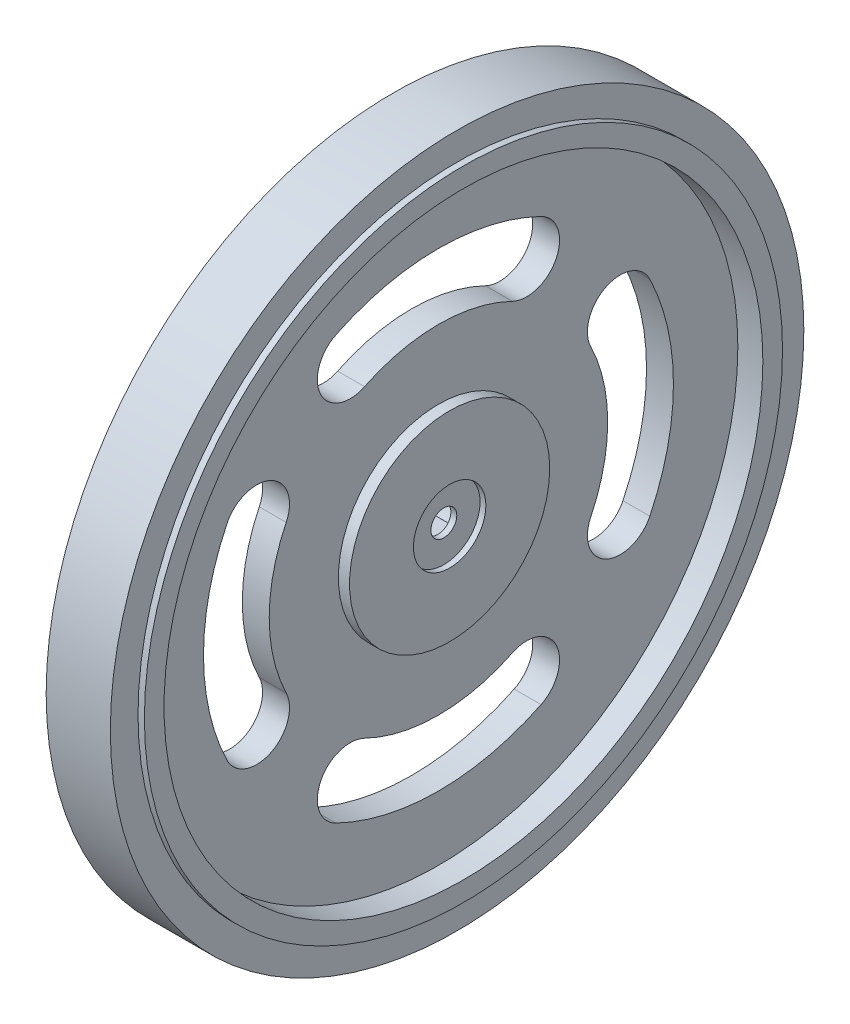
ISO-10303-21;
HEADER;
FILE_DESCRIPTION(('STEP AP214'),'2;1');
FILE_NAME('part.step','',(''),(''),'','','');
FILE_SCHEMA(('AUTOMOTIVE_DESIGN { 1 0 10303 214 1 1 1 1 }'));
ENDSEC;
DATA;
#1=APPLICATION_CONTEXT('core data for automotive mechanical design processes');
#2=APPLICATION_PROTOCOL_DEFINITION('international standard','automotive_design',2000,#1);
#3=PRODUCT_CONTEXT('',#1,'mechanical');
#4=PRODUCT('Part','Part','',(#3));
#5=PRODUCT_RELATED_PRODUCT_CATEGORY('part','',(#4));
#6=PRODUCT_DEFINITION_FORMATION('','',#4);
#7=PRODUCT_DEFINITION_CONTEXT('part definition',#1,'design');
#8=PRODUCT_DEFINITION('design','',#6,#7);
#9=PRODUCT_DEFINITION_SHAPE('','',#8);
#10=(LENGTH_UNIT() NAMED_UNIT(*) SI_UNIT(.MILLI.,.METRE.));
#11=(NAMED_UNIT(*) PLANE_ANGLE_UNIT() SI_UNIT($,.RADIAN.));
#12=(NAMED_UNIT(*) SI_UNIT($,.STERADIAN.) SOLID_ANGLE_UNIT());
#13=UNCERTAINTY_MEASURE_WITH_UNIT(LENGTH_MEASURE(1.E-05),#10,'distance_accuracy_value','');
#14=(GEOMETRIC_REPRESENTATION_CONTEXT(3) GLOBAL_UNCERTAINTY_ASSIGNED_CONTEXT((#13)) GLOBAL_UNIT_ASSIGNED_CONTEXT((#10,
#11,#12)) REPRESENTATION_CONTEXT('',''));
#15=CARTESIAN_POINT('',(0.,0.,0.));
#16=DIRECTION('',(0.,0.,1.));
#17=DIRECTION('',(1.,0.,0.));
#18=AXIS2_PLACEMENT_3D('',#15,#16,#17);
#19=CARTESIAN_POINT('',(15.9165289224664,0.,0.));
#20=DIRECTION('',(1.,0.,0.));
#21=DIRECTION('',(0.,0.,-1.));
#22=AXIS2_PLACEMENT_3D('',#19,#20,#21);
#23=CYLINDRICAL_SURFACE('',#22,3.49999999999999);
#24=CARTESIAN_POINT('',(-3.9,0.,0.));
#25=DIRECTION('',(1.,0.,0.));
#26=DIRECTION('',(0.,0.,-1.));
#27=AXIS2_PLACEMENT_3D('',#24,#25,#26);
#28=CIRCLE('',#27,3.49999999999999);
#29=CARTESIAN_POINT('',(-3.9,-2.375,-2.57087047515038));
#30=VERTEX_POINT('',#29);
#31=CARTESIAN_POINT('',(-3.9,2.375,-2.57087047515038));
#32=VERTEX_POINT('',#31);
#33=EDGE_CURVE('E196',#30,#32,#28,.T.);
#34=ORIENTED_EDGE('',*,*,#33,.F.);
#35=DIRECTION('',(1.,0.,0.));
#36=VECTOR('',#35,1.);
#37=CARTESIAN_POINT('',(-9.16337581785681,-2.375,-2.57087047515038));
#38=LINE('',#37,#36);
#39=CARTESIAN_POINT('',(1.25,-2.375,-2.57087047515038));
#40=VERTEX_POINT('',#39);
#41=EDGE_CURVE('E176',#30,#40,#38,.T.);
#42=ORIENTED_EDGE('',*,*,#41,.T.);
#43=CARTESIAN_POINT('',(1.25,0.,0.));
#44=DIRECTION('',(1.,0.,0.));
#45=DIRECTION('',(0.,0.,-1.));
#46=AXIS2_PLACEMENT_3D('',#43,#44,#45);
#47=CIRCLE('',#46,3.49999999999999);
#48=CARTESIAN_POINT('',(1.25,2.375,-2.57087047515038));
#49=VERTEX_POINT('',#48);
#50=EDGE_CURVE('E58',#40,#49,#47,.T.);
#51=ORIENTED_EDGE('',*,*,#50,.T.);
#52=DIRECTION('',(1.,0.,0.));
#53=VECTOR('',#52,1.);
#54=CARTESIAN_POINT('',(-9.16337581785681,2.375,-2.57087047515038));
#55=LINE('',#54,#53);
#56=EDGE_CURVE('E659',#32,#49,#55,.T.);
#57=ORIENTED_EDGE('',*,*,#56,.F.);
#58=EDGE_LOOP('',(#34,#42,#51,#57));
#59=FACE_BOUND('',#58,.T.);
#60=ADVANCED_FACE('F35',(#59),#23,.F.);
#61=CARTESIAN_POINT('',(1.25,2.375,2.57087047515038));
#62=VERTEX_POINT('',#61);
#63=CARTESIAN_POINT('',(1.25,-2.375,2.57087047515038));
#64=VERTEX_POINT('',#63);
#65=EDGE_CURVE('E188',#62,#64,#47,.T.);
#66=ORIENTED_EDGE('',*,*,#65,.T.);
#67=DIRECTION('',(1.,0.,0.));
#68=VECTOR('',#67,1.);
#69=CARTESIAN_POINT('',(-9.16337581785681,-2.375,2.57087047515038));
#70=LINE('',#69,#68);
#71=CARTESIAN_POINT('',(-3.9,-2.375,2.57087047515038));
#72=VERTEX_POINT('',#71);
#73=EDGE_CURVE('E174',#72,#64,#70,.T.);
#74=ORIENTED_EDGE('',*,*,#73,.F.);
#75=CARTESIAN_POINT('',(-3.9,2.375,2.57087047515039));
#76=VERTEX_POINT('',#75);
#77=EDGE_CURVE('E186',#76,#72,#28,.T.);
#78=ORIENTED_EDGE('',*,*,#77,.F.);
#79=DIRECTION('',(1.,0.,0.));
#80=VECTOR('',#79,1.);
#81=CARTESIAN_POINT('',(-9.16337581785681,2.375,2.57087047515038));
#82=LINE('',#81,#80);
#83=EDGE_CURVE('E178',#76,#62,#82,.T.);
#84=ORIENTED_EDGE('',*,*,#83,.T.);
#85=EDGE_LOOP('',(#66,#74,#78,#84));
#86=FACE_BOUND('',#85,.T.);
#87=ADVANCED_FACE('F184',(#86),#23,.F.);
#88=CARTESIAN_POINT('',(1.25,3.49999999999999,0.));
#89=DIRECTION('',(-1.,0.,0.));
#90=DIRECTION('',(0.,0.,1.));
#91=AXIS2_PLACEMENT_3D('',#88,#89,#90);
#92=PLANE('',#91);
#93=CARTESIAN_POINT('',(1.25,0.,0.));
#94=DIRECTION('',(1.,0.,0.));
#95=DIRECTION('',(0.,0.,-1.));
#96=AXIS2_PLACEMENT_3D('',#93,#94,#95);
#97=CIRCLE('',#96,1.25);
#98=CARTESIAN_POINT('',(1.25,0.,-1.25));
#99=VERTEX_POINT('',#98);
#100=EDGE_CURVE('E652',#99,#99,#97,.T.);
#101=ORIENTED_EDGE('',*,*,#100,.T.);
#102=EDGE_LOOP('',(#101));
#103=FACE_BOUND('',#102,.T.);
#104=ORIENTED_EDGE('',*,*,#50,.F.);
#105=DIRECTION('',(0.,0.,-1.));
#106=VECTOR('',#105,1.);
#107=CARTESIAN_POINT('',(1.25,-2.375,-2.57087047515038));
#108=LINE('',#107,#106);
#109=EDGE_CURVE('E179',#64,#40,#108,.T.);
#110=ORIENTED_EDGE('',*,*,#109,.F.);
#111=ORIENTED_EDGE('',*,*,#65,.F.);
#112=DIRECTION('',(0.,0.,1.));
#113=VECTOR('',#112,1.);
#114=CARTESIAN_POINT('',(1.25,2.375,-2.57087047515038));
#115=LINE('',#114,#113);
#116=EDGE_CURVE('E658',#49,#62,#115,.T.);
#117=ORIENTED_EDGE('',*,*,#116,.F.);
#118=EDGE_LOOP('',(#104,#110,#111,#117));
#119=FACE_BOUND('',#118,.T.);
#120=ADVANCED_FACE('F246',(#103,#119),#92,.T.);
#121=CARTESIAN_POINT('',(3.715,28.925,0.));
#122=DIRECTION('',(1.,0.,0.));
#123=DIRECTION('',(0.,0.,-1.));
#124=AXIS2_PLACEMENT_3D('',#121,#122,#123);
#125=PLANE('',#124);
#126=CARTESIAN_POINT('',(3.715,0.,0.));
#127=DIRECTION('',(1.,0.,0.));
#128=DIRECTION('',(0.,0.,-1.));
#129=AXIS2_PLACEMENT_3D('',#126,#127,#128);
#130=CIRCLE('',#129,30.825);
#131=CARTESIAN_POINT('',(3.715,0.,-30.825));
#132=VERTEX_POINT('',#131);
#133=EDGE_CURVE('E11',#132,#132,#130,.T.);
#134=ORIENTED_EDGE('',*,*,#133,.T.);
#135=EDGE_LOOP('',(#134));
#136=FACE_BOUND('',#135,.T.);
#137=CARTESIAN_POINT('',(3.715,0.,0.));
#138=DIRECTION('',(1.,0.,0.));
#139=DIRECTION('',(0.,0.,-1.));
#140=AXIS2_PLACEMENT_3D('',#137,#138,#139);
#141=CIRCLE('',#140,28.925);
#142=CARTESIAN_POINT('',(3.715,0.,-28.925));
#143=VERTEX_POINT('',#142);
#144=EDGE_CURVE('E627',#143,#143,#141,.T.);
#145=ORIENTED_EDGE('',*,*,#144,.F.);
#146=EDGE_LOOP('',(#145));
#147=FACE_BOUND('',#146,.T.);
#148=ADVANCED_FACE('F37',(#136,#147),#125,.T.);
#149=CARTESIAN_POINT('',(15.9165289224664,0.,0.));
#150=DIRECTION('',(1.,0.,0.));
#151=DIRECTION('',(0.,0.,-1.));
#152=AXIS2_PLACEMENT_3D('',#149,#150,#151);
#153=CYLINDRICAL_SURFACE('',#152,30.825);
#154=CARTESIAN_POINT('',(3.1,0.,0.));
#155=DIRECTION('',(1.,0.,0.));
#156=DIRECTION('',(0.,0.,-1.));
#157=AXIS2_PLACEMENT_3D('',#154,#155,#156);
#158=CIRCLE('',#157,30.825);
#159=CARTESIAN_POINT('',(3.1,0.,-30.825));
#160=VERTEX_POINT('',#159);
#161=EDGE_CURVE('E43',#160,#160,#158,.T.);
#162=ORIENTED_EDGE('',*,*,#161,.T.);
#163=EDGE_LOOP('',(#162));
#164=FACE_BOUND('',#163,.T.);
#165=ORIENTED_EDGE('',*,*,#133,.F.);
#166=EDGE_LOOP('',(#165));
#167=FACE_BOUND('',#166,.T.);
#168=ADVANCED_FACE('F226',(#164,#167),#153,.T.);
#169=CARTESIAN_POINT('',(3.1,30.825,0.));
#170=DIRECTION('',(1.,0.,0.));
#171=DIRECTION('',(0.,0.,-1.));
#172=AXIS2_PLACEMENT_3D('',#169,#170,#171);
#173=PLANE('',#172);
#174=CARTESIAN_POINT('',(3.1,0.,0.));
#175=DIRECTION('',(1.,0.,0.));
#176=DIRECTION('',(0.,0.,-1.));
#177=AXIS2_PLACEMENT_3D('',#174,#175,#176);
#178=CIRCLE('',#177,33.5);
#179=CARTESIAN_POINT('',(3.1,0.,-33.5));
#180=VERTEX_POINT('',#179);
#181=EDGE_CURVE('E221',#180,#180,#178,.T.);
#182=ORIENTED_EDGE('',*,*,#181,.T.);
#183=EDGE_LOOP('',(#182));
#184=FACE_BOUND('',#183,.T.);
#185=ORIENTED_EDGE('',*,*,#161,.F.);
#186=EDGE_LOOP('',(#185));
#187=FACE_BOUND('',#186,.T.);
#188=ADVANCED_FACE('F229',(#184,#187),#173,.T.);
#189=CARTESIAN_POINT('',(15.9165289224664,0.,0.));
#190=DIRECTION('',(1.,0.,0.));
#191=DIRECTION('',(0.,0.,-1.));
#192=AXIS2_PLACEMENT_3D('',#189,#190,#191);
#193=CYLINDRICAL_SURFACE('',#192,33.5);
#194=CARTESIAN_POINT('',(-3.1,0.,0.));
#195=DIRECTION('',(1.,0.,0.));
#196=DIRECTION('',(0.,0.,-1.));
#197=AXIS2_PLACEMENT_3D('',#194,#195,#196);
#198=CIRCLE('',#197,33.5);
#199=CARTESIAN_POINT('',(-3.1,0.,-33.5));
#200=VERTEX_POINT('',#199);
#201=EDGE_CURVE('E218',#200,#200,#198,.T.);
#202=ORIENTED_EDGE('',*,*,#201,.T.);
#203=EDGE_LOOP('',(#202));
#204=FACE_BOUND('',#203,.T.);
#205=ORIENTED_EDGE('',*,*,#181,.F.);
#206=EDGE_LOOP('',(#205));
#207=FACE_BOUND('',#206,.T.);
#208=ADVANCED_FACE('F231',(#204,#207),#193,.T.);
#209=CARTESIAN_POINT('',(-3.1,33.5,0.));
#210=DIRECTION('',(-1.,0.,0.));
#211=DIRECTION('',(0.,0.,1.));
#212=AXIS2_PLACEMENT_3D('',#209,#210,#211);
#213=PLANE('',#212);
#214=CARTESIAN_POINT('',(-3.1,0.,0.));
#215=DIRECTION('',(1.,0.,0.));
#216=DIRECTION('',(0.,0.,-1.));
#217=AXIS2_PLACEMENT_3D('',#214,#215,#216);
#218=CIRCLE('',#217,30.825);
#219=CARTESIAN_POINT('',(-3.1,0.,-30.825));
#220=VERTEX_POINT('',#219);
#221=EDGE_CURVE('E215',#220,#220,#218,.T.);
#222=ORIENTED_EDGE('',*,*,#221,.T.);
#223=EDGE_LOOP('',(#222));
#224=FACE_BOUND('',#223,.T.);
#225=ORIENTED_EDGE('',*,*,#201,.F.);
#226=EDGE_LOOP('',(#225));
#227=FACE_BOUND('',#226,.T.);
#228=ADVANCED_FACE('F238',(#224,#227),#213,.T.);
#229=CARTESIAN_POINT('',(15.9165289224664,0.,0.));
#230=DIRECTION('',(1.,0.,0.));
#231=DIRECTION('',(0.,0.,-1.));
#232=AXIS2_PLACEMENT_3D('',#229,#230,#231);
#233=CYLINDRICAL_SURFACE('',#232,30.825);
#234=CARTESIAN_POINT('',(-3.715,0.,0.));
#235=DIRECTION('',(1.,0.,0.));
#236=DIRECTION('',(0.,0.,-1.));
#237=AXIS2_PLACEMENT_3D('',#234,#235,#236);
#238=CIRCLE('',#237,30.825);
#239=CARTESIAN_POINT('',(-3.715,0.,-30.825));
#240=VERTEX_POINT('',#239);
#241=EDGE_CURVE('E212',#240,#240,#238,.T.);
#242=ORIENTED_EDGE('',*,*,#241,.T.);
#243=EDGE_LOOP('',(#242));
#244=FACE_BOUND('',#243,.T.);
#245=ORIENTED_EDGE('',*,*,#221,.F.);
#246=EDGE_LOOP('',(#245));
#247=FACE_BOUND('',#246,.T.);
#248=ADVANCED_FACE('F268',(#244,#247),#233,.T.);
#249=CARTESIAN_POINT('',(-3.715,30.825,0.));
#250=DIRECTION('',(-1.,0.,0.));
#251=DIRECTION('',(0.,0.,1.));
#252=AXIS2_PLACEMENT_3D('',#249,#250,#251);
#253=PLANE('',#252);
#254=CARTESIAN_POINT('',(-3.715,0.,0.));
#255=DIRECTION('',(1.,0.,0.));
#256=DIRECTION('',(0.,0.,-1.));
#257=AXIS2_PLACEMENT_3D('',#254,#255,#256);
#258=CIRCLE('',#257,28.925);
#259=CARTESIAN_POINT('',(-3.715,0.,-28.925));
#260=VERTEX_POINT('',#259);
#261=EDGE_CURVE('E209',#260,#260,#258,.T.);
#262=ORIENTED_EDGE('',*,*,#261,.T.);
#263=EDGE_LOOP('',(#262));
#264=FACE_BOUND('',#263,.T.);
#265=ORIENTED_EDGE('',*,*,#241,.F.);
#266=EDGE_LOOP('',(#265));
#267=FACE_BOUND('',#266,.T.);
#268=ADVANCED_FACE('F264',(#264,#267),#253,.T.);
#269=CARTESIAN_POINT('',(15.9165289224664,0.,0.));
#270=DIRECTION('',(1.,0.,0.));
#271=DIRECTION('',(0.,0.,-1.));
#272=AXIS2_PLACEMENT_3D('',#269,#270,#271);
#273=CYLINDRICAL_SURFACE('',#272,28.925);
#274=CARTESIAN_POINT('',(-1.3,0.,0.));
#275=DIRECTION('',(1.,0.,0.));
#276=DIRECTION('',(0.,0.,-1.));
#277=AXIS2_PLACEMENT_3D('',#274,#275,#276);
#278=CIRCLE('',#277,28.925);
#279=CARTESIAN_POINT('',(-1.3,0.,-28.925));
#280=VERTEX_POINT('',#279);
#281=EDGE_CURVE('E206',#280,#280,#278,.T.);
#282=ORIENTED_EDGE('',*,*,#281,.T.);
#283=EDGE_LOOP('',(#282));
#284=FACE_BOUND('',#283,.T.);
#285=ORIENTED_EDGE('',*,*,#261,.F.);
#286=EDGE_LOOP('',(#285));
#287=FACE_BOUND('',#286,.T.);
#288=ADVANCED_FACE('F260',(#284,#287),#273,.F.);
#289=CARTESIAN_POINT('',(-1.3,4.975,0.));
#290=DIRECTION('',(-1.,0.,0.));
#291=DIRECTION('',(0.,0.,1.));
#292=AXIS2_PLACEMENT_3D('',#289,#290,#291);
#293=PLANE('',#292);
#294=CARTESIAN_POINT('',(-1.3,8.52500000000018,17.5655913649383));
#295=DIRECTION('',(-1.,0.,0.));
#296=DIRECTION('',(0.,0.,1.));
#297=AXIS2_PLACEMENT_3D('',#294,#295,#296);
#298=CIRCLE('',#297,3.17500000000001);
#299=CARTESIAN_POINT('',(-1.3,7.13873239436634,14.7092147921507));
#300=VERTEX_POINT('',#299);
#301=CARTESIAN_POINT('',(-1.3,9.91126760563401,20.421967937726));
#302=VERTEX_POINT('',#301);
#303=EDGE_CURVE('E672',#300,#302,#298,.F.);
#304=ORIENTED_EDGE('',*,*,#303,.T.);
#305=CARTESIAN_POINT('',(-1.3,0.,0.));
#306=DIRECTION('',(-1.,0.,0.));
#307=DIRECTION('',(0.,0.,1.));
#308=AXIS2_PLACEMENT_3D('',#305,#306,#307);
#309=CIRCLE('',#308,22.7);
#310=CARTESIAN_POINT('',(-1.3,-9.91126760563358,20.4219679377262));
#311=VERTEX_POINT('',#310);
#312=EDGE_CURVE('E689',#302,#311,#309,.F.);
#313=ORIENTED_EDGE('',*,*,#312,.T.);
#314=CARTESIAN_POINT('',(-1.3,-8.52499999999981,17.5655913649385));
#315=DIRECTION('',(-1.,0.,0.));
#316=DIRECTION('',(0.,0.,1.));
#317=AXIS2_PLACEMENT_3D('',#314,#315,#316);
#318=CIRCLE('',#317,3.17500000000001);
#319=CARTESIAN_POINT('',(-1.3,-7.13873239436603,14.7092147921508));
#320=VERTEX_POINT('',#319);
#321=EDGE_CURVE('E661',#311,#320,#318,.F.);
#322=ORIENTED_EDGE('',*,*,#321,.T.);
#323=CARTESIAN_POINT('',(-1.3,0.,0.));
#324=DIRECTION('',(-1.,0.,0.));
#325=DIRECTION('',(0.,0.,1.));
#326=AXIS2_PLACEMENT_3D('',#323,#324,#325);
#327=CIRCLE('',#326,16.35);
#328=EDGE_CURVE('E669',#320,#300,#327,.T.);
#329=ORIENTED_EDGE('',*,*,#328,.T.);
#330=EDGE_LOOP('',(#304,#313,#322,#329));
#331=FACE_BOUND('',#330,.T.);
#332=CARTESIAN_POINT('',(-1.3,-17.5655913649384,8.52499999999998));
#333=DIRECTION('',(-1.,0.,0.));
#334=DIRECTION('',(0.,0.,1.));
#335=AXIS2_PLACEMENT_3D('',#332,#333,#334);
#336=CIRCLE('',#335,3.175);
#337=CARTESIAN_POINT('',(-1.3,-14.7092147921508,7.13873239436619));
#338=VERTEX_POINT('',#337);
#339=CARTESIAN_POINT('',(-1.3,-20.4219679377261,9.91126760563379));
#340=VERTEX_POINT('',#339);
#341=EDGE_CURVE('E704',#338,#340,#336,.F.);
#342=ORIENTED_EDGE('',*,*,#341,.T.);
#343=CARTESIAN_POINT('',(-1.3,0.,0.));
#344=DIRECTION('',(-1.,0.,0.));
#345=DIRECTION('',(0.,0.,1.));
#346=AXIS2_PLACEMENT_3D('',#343,#344,#345);
#347=CIRCLE('',#346,22.7);
#348=CARTESIAN_POINT('',(-1.3,-20.4219679377261,-9.91126760563382));
#349=VERTEX_POINT('',#348);
#350=EDGE_CURVE('E721',#340,#349,#347,.F.);
#351=ORIENTED_EDGE('',*,*,#350,.T.);
#352=CARTESIAN_POINT('',(-1.3,-17.5655913649384,-8.52500000000001));
#353=DIRECTION('',(-1.,0.,0.));
#354=DIRECTION('',(0.,0.,1.));
#355=AXIS2_PLACEMENT_3D('',#352,#353,#354);
#356=CIRCLE('',#355,3.17500000000001);
#357=CARTESIAN_POINT('',(-1.3,-14.7092147921507,-7.1387323943662));
#358=VERTEX_POINT('',#357);
#359=EDGE_CURVE('E698',#349,#358,#356,.F.);
#360=ORIENTED_EDGE('',*,*,#359,.T.);
#361=CARTESIAN_POINT('',(-1.3,0.,0.));
#362=DIRECTION('',(-1.,0.,0.));
#363=DIRECTION('',(0.,0.,1.));
#364=AXIS2_PLACEMENT_3D('',#361,#362,#363);
#365=CIRCLE('',#364,16.35);
#366=EDGE_CURVE('E701',#358,#338,#365,.T.);
#367=ORIENTED_EDGE('',*,*,#366,.T.);
#368=EDGE_LOOP('',(#342,#351,#360,#367));
#369=FACE_BOUND('',#368,.T.);
#370=CARTESIAN_POINT('',(-1.3,-8.52499999999992,-17.5655913649385));
#371=DIRECTION('',(-1.,0.,0.));
#372=DIRECTION('',(0.,0.,1.));
#373=AXIS2_PLACEMENT_3D('',#370,#371,#372);
#374=CIRCLE('',#373,3.17500000000001);
#375=CARTESIAN_POINT('',(-1.3,-7.13873239436612,-14.7092147921508));
#376=VERTEX_POINT('',#375);
#377=CARTESIAN_POINT('',(-1.3,-9.91126760563371,-20.4219679377262));
#378=VERTEX_POINT('',#377);
#379=EDGE_CURVE('E736',#376,#378,#374,.F.);
#380=ORIENTED_EDGE('',*,*,#379,.T.);
#381=CARTESIAN_POINT('',(-1.3,0.,0.));
#382=DIRECTION('',(-1.,0.,0.));
#383=DIRECTION('',(0.,0.,1.));
#384=AXIS2_PLACEMENT_3D('',#381,#382,#383);
#385=CIRCLE('',#384,22.7);
#386=CARTESIAN_POINT('',(-1.3,9.91126760563388,-20.4219679377261));
#387=VERTEX_POINT('',#386);
#388=EDGE_CURVE('E753',#378,#387,#385,.F.);
#389=ORIENTED_EDGE('',*,*,#388,.T.);
#390=CARTESIAN_POINT('',(-1.3,8.52500000000007,-17.5655913649384));
#391=DIRECTION('',(-1.,0.,0.));
#392=DIRECTION('',(0.,0.,1.));
#393=AXIS2_PLACEMENT_3D('',#390,#391,#392);
#394=CIRCLE('',#393,3.17500000000001);
#395=CARTESIAN_POINT('',(-1.3,7.13873239436625,-14.7092147921507));
#396=VERTEX_POINT('',#395);
#397=EDGE_CURVE('E730',#387,#396,#394,.F.);
#398=ORIENTED_EDGE('',*,*,#397,.T.);
#399=CARTESIAN_POINT('',(-1.3,0.,0.));
#400=DIRECTION('',(-1.,0.,0.));
#401=DIRECTION('',(0.,0.,1.));
#402=AXIS2_PLACEMENT_3D('',#399,#400,#401);
#403=CIRCLE('',#402,16.35);
#404=EDGE_CURVE('E733',#396,#376,#403,.T.);
#405=ORIENTED_EDGE('',*,*,#404,.T.);
#406=EDGE_LOOP('',(#380,#389,#398,#405));
#407=FACE_BOUND('',#406,.T.);
#408=CARTESIAN_POINT('',(-1.3,17.5655913649385,-8.52499999999986));
#409=DIRECTION('',(-1.,0.,0.));
#410=DIRECTION('',(0.,0.,1.));
#411=AXIS2_PLACEMENT_3D('',#408,#409,#410);
#412=CIRCLE('',#411,3.17500000000001);
#413=CARTESIAN_POINT('',(-1.3,14.7092147921508,-7.13873239436607));
#414=VERTEX_POINT('',#413);
#415=CARTESIAN_POINT('',(-1.3,20.4219679377262,-9.91126760563364));
#416=VERTEX_POINT('',#415);
#417=EDGE_CURVE('E768',#414,#416,#412,.F.);
#418=ORIENTED_EDGE('',*,*,#417,.T.);
#419=CARTESIAN_POINT('',(-1.3,0.,0.));
#420=DIRECTION('',(-1.,0.,0.));
#421=DIRECTION('',(0.,0.,1.));
#422=AXIS2_PLACEMENT_3D('',#419,#420,#421);
#423=CIRCLE('',#422,22.7);
#424=CARTESIAN_POINT('',(-1.3,20.4219679377261,9.91126760563396));
#425=VERTEX_POINT('',#424);
#426=EDGE_CURVE('E629',#416,#425,#423,.F.);
#427=ORIENTED_EDGE('',*,*,#426,.T.);
#428=CARTESIAN_POINT('',(-1.3,17.5655913649384,8.52500000000013));
#429=DIRECTION('',(-1.,0.,0.));
#430=DIRECTION('',(0.,0.,1.));
#431=AXIS2_PLACEMENT_3D('',#428,#429,#430);
#432=CIRCLE('',#431,3.17500000000001);
#433=CARTESIAN_POINT('',(-1.3,14.7092147921507,7.1387323943663));
#434=VERTEX_POINT('',#433);
#435=EDGE_CURVE('E762',#425,#434,#432,.F.);
#436=ORIENTED_EDGE('',*,*,#435,.T.);
#437=CARTESIAN_POINT('',(-1.3,0.,0.));
#438=DIRECTION('',(-1.,0.,0.));
#439=DIRECTION('',(0.,0.,1.));
#440=AXIS2_PLACEMENT_3D('',#437,#438,#439);
#441=CIRCLE('',#440,16.35);
#442=EDGE_CURVE('E765',#434,#414,#441,.T.);
#443=ORIENTED_EDGE('',*,*,#442,.T.);
#444=EDGE_LOOP('',(#418,#427,#436,#443));
#445=FACE_BOUND('',#444,.T.);
#446=CARTESIAN_POINT('',(-1.3,0.,0.));
#447=DIRECTION('',(1.,0.,0.));
#448=DIRECTION('',(0.,0.,-1.));
#449=AXIS2_PLACEMENT_3D('',#446,#447,#448);
#450=CIRCLE('',#449,4.975);
#451=CARTESIAN_POINT('',(-1.3,0.,-4.975));
#452=VERTEX_POINT('',#451);
#453=EDGE_CURVE('E199',#452,#452,#450,.T.);
#454=ORIENTED_EDGE('',*,*,#453,.T.);
#455=EDGE_LOOP('',(#454));
#456=FACE_BOUND('',#455,.T.);
#457=ORIENTED_EDGE('',*,*,#281,.F.);
#458=EDGE_LOOP('',(#457));
#459=FACE_BOUND('',#458,.T.);
#460=ADVANCED_FACE('F256',(#331,#369,#407,#445,#456,#459),#293,.T.);
#461=CARTESIAN_POINT('',(-1.3,0.,0.));
#462=DIRECTION('',(1.,0.,0.));
#463=DIRECTION('',(0.,0.,-1.));
#464=AXIS2_PLACEMENT_3D('',#461,#462,#463);
#465=CONICAL_SURFACE('',#464,4.975,0.180699523279293);
#466=CARTESIAN_POINT('',(-3.9,0.,0.));
#467=DIRECTION('',(1.,0.,0.));
#468=DIRECTION('',(0.,0.,-1.));
#469=AXIS2_PLACEMENT_3D('',#466,#467,#468);
#470=CIRCLE('',#469,4.5);
#471=CARTESIAN_POINT('',(-3.9,0.,-4.5));
#472=VERTEX_POINT('',#471);
#473=EDGE_CURVE('E195',#472,#472,#470,.T.);
#474=ORIENTED_EDGE('',*,*,#473,.T.);
#475=EDGE_LOOP('',(#474));
#476=FACE_BOUND('',#475,.T.);
#477=ORIENTED_EDGE('',*,*,#453,.F.);
#478=EDGE_LOOP('',(#477));
#479=FACE_BOUND('',#478,.T.);
#480=ADVANCED_FACE('F253',(#476,#479),#465,.T.);
#481=CARTESIAN_POINT('',(-3.9,4.5,0.));
#482=DIRECTION('',(-1.,0.,0.));
#483=DIRECTION('',(0.,0.,1.));
#484=AXIS2_PLACEMENT_3D('',#481,#482,#483);
#485=PLANE('',#484);
#486=ORIENTED_EDGE('',*,*,#77,.T.);
#487=DIRECTION('',(0.,0.,-1.));
#488=VECTOR('',#487,1.);
#489=CARTESIAN_POINT('',(-3.9,-2.375,-2.57087047515038));
#490=LINE('',#489,#488);
#491=EDGE_CURVE('E50',#72,#30,#490,.T.);
#492=ORIENTED_EDGE('',*,*,#491,.T.);
#493=ORIENTED_EDGE('',*,*,#33,.T.);
#494=DIRECTION('',(0.,0.,1.));
#495=VECTOR('',#494,1.);
#496=CARTESIAN_POINT('',(-3.9,2.375,-2.57087047515038));
#497=LINE('',#496,#495);
#498=EDGE_CURVE('E194',#32,#76,#497,.T.);
#499=ORIENTED_EDGE('',*,*,#498,.T.);
#500=EDGE_LOOP('',(#486,#492,#493,#499));
#501=FACE_BOUND('',#500,.T.);
#502=ORIENTED_EDGE('',*,*,#473,.F.);
#503=EDGE_LOOP('',(#502));
#504=FACE_BOUND('',#503,.T.);
#505=ADVANCED_FACE('F191',(#501,#504),#485,.T.);
#506=CARTESIAN_POINT('',(15.9165289224664,0.,0.));
#507=DIRECTION('',(1.,0.,0.));
#508=DIRECTION('',(0.,0.,-1.));
#509=AXIS2_PLACEMENT_3D('',#506,#507,#508);
#510=CYLINDRICAL_SURFACE('',#509,1.25);
#511=CARTESIAN_POINT('',(1.82,0.,0.));
#512=DIRECTION('',(1.,0.,0.));
#513=DIRECTION('',(0.,0.,-1.));
#514=AXIS2_PLACEMENT_3D('',#511,#512,#513);
#515=CIRCLE('',#514,1.25);
#516=CARTESIAN_POINT('',(1.82,0.,-1.25));
#517=VERTEX_POINT('',#516);
#518=EDGE_CURVE('E650',#517,#517,#515,.T.);
#519=ORIENTED_EDGE('',*,*,#518,.T.);
#520=EDGE_LOOP('',(#519));
#521=FACE_BOUND('',#520,.T.);
#522=ORIENTED_EDGE('',*,*,#100,.F.);
#523=EDGE_LOOP('',(#522));
#524=FACE_BOUND('',#523,.T.);
#525=ADVANCED_FACE('F252',(#521,#524),#510,.F.);
#526=CARTESIAN_POINT('',(1.82,1.25,0.));
#527=DIRECTION('',(1.,0.,0.));
#528=DIRECTION('',(0.,0.,-1.));
#529=AXIS2_PLACEMENT_3D('',#526,#527,#528);
#530=PLANE('',#529);
#531=CARTESIAN_POINT('',(1.82,0.,0.));
#532=DIRECTION('',(1.,0.,0.));
#533=DIRECTION('',(0.,0.,-1.));
#534=AXIS2_PLACEMENT_3D('',#531,#532,#533);
#535=CIRCLE('',#534,3.49999999999999);
#536=CARTESIAN_POINT('',(1.82,0.,-3.49999999999999));
#537=VERTEX_POINT('',#536);
#538=EDGE_CURVE('E647',#537,#537,#535,.T.);
#539=ORIENTED_EDGE('',*,*,#538,.T.);
#540=EDGE_LOOP('',(#539));
#541=FACE_BOUND('',#540,.T.);
#542=ORIENTED_EDGE('',*,*,#518,.F.);
#543=EDGE_LOOP('',(#542));
#544=FACE_BOUND('',#543,.T.);
#545=ADVANCED_FACE('F319',(#541,#544),#530,.T.);
#546=CARTESIAN_POINT('',(15.9165289224664,0.,0.));
#547=DIRECTION('',(1.,0.,0.));
#548=DIRECTION('',(0.,0.,-1.));
#549=AXIS2_PLACEMENT_3D('',#546,#547,#548);
#550=CYLINDRICAL_SURFACE('',#549,3.49999999999999);
#551=CARTESIAN_POINT('',(2.38,0.,0.));
#552=DIRECTION('',(1.,0.,0.));
#553=DIRECTION('',(0.,0.,-1.));
#554=AXIS2_PLACEMENT_3D('',#551,#552,#553);
#555=CIRCLE('',#554,3.49999999999999);
#556=CARTESIAN_POINT('',(2.38,0.,-3.49999999999999));
#557=VERTEX_POINT('',#556);
#558=EDGE_CURVE('E644',#557,#557,#555,.T.);
#559=ORIENTED_EDGE('',*,*,#558,.T.);
#560=EDGE_LOOP('',(#559));
#561=FACE_BOUND('',#560,.T.);
#562=ORIENTED_EDGE('',*,*,#538,.F.);
#563=EDGE_LOOP('',(#562));
#564=FACE_BOUND('',#563,.T.);
#565=ADVANCED_FACE('F326',(#561,#564),#550,.F.);
#566=CARTESIAN_POINT('',(2.38,3.49999999999999,0.));
#567=DIRECTION('',(1.,0.,0.));
#568=DIRECTION('',(0.,0.,-1.));
#569=AXIS2_PLACEMENT_3D('',#566,#567,#568);
#570=PLANE('',#569);
#571=CARTESIAN_POINT('',(2.38,0.,0.));
#572=DIRECTION('',(1.,0.,0.));
#573=DIRECTION('',(0.,0.,-1.));
#574=AXIS2_PLACEMENT_3D('',#571,#572,#573);
#575=CIRCLE('',#574,9.67);
#576=CARTESIAN_POINT('',(2.38,0.,-9.67));
#577=VERTEX_POINT('',#576);
#578=EDGE_CURVE('E641',#577,#577,#575,.T.);
#579=ORIENTED_EDGE('',*,*,#578,.T.);
#580=EDGE_LOOP('',(#579));
#581=FACE_BOUND('',#580,.T.);
#582=ORIENTED_EDGE('',*,*,#558,.F.);
#583=EDGE_LOOP('',(#582));
#584=FACE_BOUND('',#583,.T.);
#585=ADVANCED_FACE('F334',(#581,#584),#570,.T.);
#586=CARTESIAN_POINT('',(15.9165289224664,0.,0.));
#587=DIRECTION('',(1.,0.,0.));
#588=DIRECTION('',(0.,0.,-1.));
#589=AXIS2_PLACEMENT_3D('',#586,#587,#588);
#590=CYLINDRICAL_SURFACE('',#589,9.67);
#591=CARTESIAN_POINT('',(1.3,0.,0.));
#592=DIRECTION('',(1.,0.,0.));
#593=DIRECTION('',(0.,0.,-1.));
#594=AXIS2_PLACEMENT_3D('',#591,#592,#593);
#595=CIRCLE('',#594,9.67);
#596=CARTESIAN_POINT('',(1.3,0.,-9.67));
#597=VERTEX_POINT('',#596);
#598=EDGE_CURVE('E632',#597,#597,#595,.T.);
#599=ORIENTED_EDGE('',*,*,#598,.T.);
#600=EDGE_LOOP('',(#599));
#601=FACE_BOUND('',#600,.T.);
#602=ORIENTED_EDGE('',*,*,#578,.F.);
#603=EDGE_LOOP('',(#602));
#604=FACE_BOUND('',#603,.T.);
#605=ADVANCED_FACE('F342',(#601,#604),#590,.T.);
#606=CARTESIAN_POINT('',(1.3,28.925,0.));
#607=DIRECTION('',(1.,0.,0.));
#608=DIRECTION('',(0.,0.,-1.));
#609=AXIS2_PLACEMENT_3D('',#606,#607,#608);
#610=PLANE('',#609);
#611=CARTESIAN_POINT('',(1.3,8.52500000000018,17.5655913649383));
#612=DIRECTION('',(1.,0.,0.));
#613=DIRECTION('',(0.,0.,-1.));
#614=AXIS2_PLACEMENT_3D('',#611,#612,#613);
#615=CIRCLE('',#614,3.17500000000001);
#616=CARTESIAN_POINT('',(1.3,7.13873239436634,14.7092147921507));
#617=VERTEX_POINT('',#616);
#618=CARTESIAN_POINT('',(1.3,9.91126760563401,20.421967937726));
#619=VERTEX_POINT('',#618);
#620=EDGE_CURVE('E675',#617,#619,#615,.T.);
#621=ORIENTED_EDGE('',*,*,#620,.F.);
#622=CARTESIAN_POINT('',(1.3,0.,0.));
#623=DIRECTION('',(-1.,0.,0.));
#624=DIRECTION('',(0.,0.,-1.));
#625=AXIS2_PLACEMENT_3D('',#622,#623,#624);
#626=CIRCLE('',#625,16.35);
#627=CARTESIAN_POINT('',(1.3,-7.13873239436603,14.7092147921508));
#628=VERTEX_POINT('',#627);
#629=EDGE_CURVE('E683',#628,#617,#626,.T.);
#630=ORIENTED_EDGE('',*,*,#629,.F.);
#631=CARTESIAN_POINT('',(1.3,-8.52499999999981,17.5655913649385));
#632=DIRECTION('',(1.,0.,0.));
#633=DIRECTION('',(0.,0.,-1.));
#634=AXIS2_PLACEMENT_3D('',#631,#632,#633);
#635=CIRCLE('',#634,3.17500000000001);
#636=CARTESIAN_POINT('',(1.3,-9.91126760563358,20.4219679377262));
#637=VERTEX_POINT('',#636);
#638=EDGE_CURVE('E680',#637,#628,#635,.T.);
#639=ORIENTED_EDGE('',*,*,#638,.F.);
#640=CARTESIAN_POINT('',(1.3,0.,0.));
#641=DIRECTION('',(1.,0.,0.));
#642=DIRECTION('',(0.,0.,-1.));
#643=AXIS2_PLACEMENT_3D('',#640,#641,#642);
#644=CIRCLE('',#643,22.7);
#645=EDGE_CURVE('E677',#619,#637,#644,.T.);
#646=ORIENTED_EDGE('',*,*,#645,.F.);
#647=EDGE_LOOP('',(#621,#630,#639,#646));
#648=FACE_BOUND('',#647,.T.);
#649=CARTESIAN_POINT('',(1.3,-17.5655913649384,8.52499999999998));
#650=DIRECTION('',(1.,0.,0.));
#651=DIRECTION('',(0.,0.,-1.));
#652=AXIS2_PLACEMENT_3D('',#649,#650,#651);
#653=CIRCLE('',#652,3.175);
#654=CARTESIAN_POINT('',(1.3,-14.7092147921508,7.13873239436619));
#655=VERTEX_POINT('',#654);
#656=CARTESIAN_POINT('',(1.3,-20.4219679377261,9.91126760563379));
#657=VERTEX_POINT('',#656);
#658=EDGE_CURVE('E707',#655,#657,#653,.T.);
#659=ORIENTED_EDGE('',*,*,#658,.F.);
#660=CARTESIAN_POINT('',(1.3,0.,0.));
#661=DIRECTION('',(-1.,0.,0.));
#662=DIRECTION('',(0.,0.,-1.));
#663=AXIS2_PLACEMENT_3D('',#660,#661,#662);
#664=CIRCLE('',#663,16.35);
#665=CARTESIAN_POINT('',(1.3,-14.7092147921507,-7.1387323943662));
#666=VERTEX_POINT('',#665);
#667=EDGE_CURVE('E715',#666,#655,#664,.T.);
#668=ORIENTED_EDGE('',*,*,#667,.F.);
#669=CARTESIAN_POINT('',(1.3,-17.5655913649384,-8.52500000000001));
#670=DIRECTION('',(1.,0.,0.));
#671=DIRECTION('',(0.,0.,-1.));
#672=AXIS2_PLACEMENT_3D('',#669,#670,#671);
#673=CIRCLE('',#672,3.17500000000001);
#674=CARTESIAN_POINT('',(1.3,-20.4219679377261,-9.91126760563382));
#675=VERTEX_POINT('',#674);
#676=EDGE_CURVE('E712',#675,#666,#673,.T.);
#677=ORIENTED_EDGE('',*,*,#676,.F.);
#678=CARTESIAN_POINT('',(1.3,0.,0.));
#679=DIRECTION('',(1.,0.,0.));
#680=DIRECTION('',(0.,0.,-1.));
#681=AXIS2_PLACEMENT_3D('',#678,#679,#680);
#682=CIRCLE('',#681,22.7);
#683=EDGE_CURVE('E709',#657,#675,#682,.T.);
#684=ORIENTED_EDGE('',*,*,#683,.F.);
#685=EDGE_LOOP('',(#659,#668,#677,#684));
#686=FACE_BOUND('',#685,.T.);
#687=CARTESIAN_POINT('',(1.3,-8.52499999999992,-17.5655913649385));
#688=DIRECTION('',(1.,0.,0.));
#689=DIRECTION('',(0.,0.,-1.));
#690=AXIS2_PLACEMENT_3D('',#687,#688,#689);
#691=CIRCLE('',#690,3.17500000000001);
#692=CARTESIAN_POINT('',(1.3,-7.13873239436612,-14.7092147921508));
#693=VERTEX_POINT('',#692);
#694=CARTESIAN_POINT('',(1.3,-9.91126760563371,-20.4219679377262));
#695=VERTEX_POINT('',#694);
#696=EDGE_CURVE('E739',#693,#695,#691,.T.);
#697=ORIENTED_EDGE('',*,*,#696,.F.);
#698=CARTESIAN_POINT('',(1.3,0.,0.));
#699=DIRECTION('',(-1.,0.,0.));
#700=DIRECTION('',(0.,0.,-1.));
#701=AXIS2_PLACEMENT_3D('',#698,#699,#700);
#702=CIRCLE('',#701,16.35);
#703=CARTESIAN_POINT('',(1.3,7.13873239436625,-14.7092147921507));
#704=VERTEX_POINT('',#703);
#705=EDGE_CURVE('E747',#704,#693,#702,.T.);
#706=ORIENTED_EDGE('',*,*,#705,.F.);
#707=CARTESIAN_POINT('',(1.3,8.52500000000007,-17.5655913649384));
#708=DIRECTION('',(1.,0.,0.));
#709=DIRECTION('',(0.,0.,-1.));
#710=AXIS2_PLACEMENT_3D('',#707,#708,#709);
#711=CIRCLE('',#710,3.17500000000001);
#712=CARTESIAN_POINT('',(1.3,9.91126760563388,-20.4219679377261));
#713=VERTEX_POINT('',#712);
#714=EDGE_CURVE('E744',#713,#704,#711,.T.);
#715=ORIENTED_EDGE('',*,*,#714,.F.);
#716=CARTESIAN_POINT('',(1.3,0.,0.));
#717=DIRECTION('',(1.,0.,0.));
#718=DIRECTION('',(0.,0.,-1.));
#719=AXIS2_PLACEMENT_3D('',#716,#717,#718);
#720=CIRCLE('',#719,22.7);
#721=EDGE_CURVE('E741',#695,#713,#720,.T.);
#722=ORIENTED_EDGE('',*,*,#721,.F.);
#723=EDGE_LOOP('',(#697,#706,#715,#722));
#724=FACE_BOUND('',#723,.T.);
#725=CARTESIAN_POINT('',(1.3,17.5655913649385,-8.52499999999986));
#726=DIRECTION('',(1.,0.,0.));
#727=DIRECTION('',(0.,0.,-1.));
#728=AXIS2_PLACEMENT_3D('',#725,#726,#727);
#729=CIRCLE('',#728,3.17500000000001);
#730=CARTESIAN_POINT('',(1.3,14.7092147921508,-7.13873239436607));
#731=VERTEX_POINT('',#730);
#732=CARTESIAN_POINT('',(1.3,20.4219679377262,-9.91126760563364));
#733=VERTEX_POINT('',#732);
#734=EDGE_CURVE('E771',#731,#733,#729,.T.);
#735=ORIENTED_EDGE('',*,*,#734,.F.);
#736=CARTESIAN_POINT('',(1.3,0.,0.));
#737=DIRECTION('',(-1.,0.,0.));
#738=DIRECTION('',(0.,0.,-1.));
#739=AXIS2_PLACEMENT_3D('',#736,#737,#738);
#740=CIRCLE('',#739,16.35);
#741=CARTESIAN_POINT('',(1.3,14.7092147921507,7.1387323943663));
#742=VERTEX_POINT('',#741);
#743=EDGE_CURVE('E779',#742,#731,#740,.T.);
#744=ORIENTED_EDGE('',*,*,#743,.F.);
#745=CARTESIAN_POINT('',(1.3,17.5655913649384,8.52500000000013));
#746=DIRECTION('',(1.,0.,0.));
#747=DIRECTION('',(0.,0.,-1.));
#748=AXIS2_PLACEMENT_3D('',#745,#746,#747);
#749=CIRCLE('',#748,3.17500000000001);
#750=CARTESIAN_POINT('',(1.3,20.4219679377261,9.91126760563396));
#751=VERTEX_POINT('',#750);
#752=EDGE_CURVE('E776',#751,#742,#749,.T.);
#753=ORIENTED_EDGE('',*,*,#752,.F.);
#754=CARTESIAN_POINT('',(1.3,0.,0.));
#755=DIRECTION('',(1.,0.,0.));
#756=DIRECTION('',(0.,0.,-1.));
#757=AXIS2_PLACEMENT_3D('',#754,#755,#756);
#758=CIRCLE('',#757,22.7);
#759=EDGE_CURVE('E773',#733,#751,#758,.T.);
#760=ORIENTED_EDGE('',*,*,#759,.F.);
#761=EDGE_LOOP('',(#735,#744,#753,#760));
#762=FACE_BOUND('',#761,.T.);
#763=CARTESIAN_POINT('',(1.3,0.,0.));
#764=DIRECTION('',(1.,0.,0.));
#765=DIRECTION('',(0.,0.,-1.));
#766=AXIS2_PLACEMENT_3D('',#763,#764,#765);
#767=CIRCLE('',#766,28.925);
#768=CARTESIAN_POINT('',(1.3,0.,-28.925));
#769=VERTEX_POINT('',#768);
#770=EDGE_CURVE('E628',#769,#769,#767,.T.);
#771=ORIENTED_EDGE('',*,*,#770,.T.);
#772=EDGE_LOOP('',(#771));
#773=FACE_BOUND('',#772,.T.);
#774=ORIENTED_EDGE('',*,*,#598,.F.);
#775=EDGE_LOOP('',(#774));
#776=FACE_BOUND('',#775,.T.);
#777=ADVANCED_FACE('F350',(#648,#686,#724,#762,#773,#776),#610,.T.);
#778=CARTESIAN_POINT('',(15.9165289224664,0.,0.));
#779=DIRECTION('',(1.,0.,0.));
#780=DIRECTION('',(0.,0.,-1.));
#781=AXIS2_PLACEMENT_3D('',#778,#779,#780);
#782=CYLINDRICAL_SURFACE('',#781,28.925);
#783=ORIENTED_EDGE('',*,*,#144,.T.);
#784=EDGE_LOOP('',(#783));
#785=FACE_BOUND('',#784,.T.);
#786=ORIENTED_EDGE('',*,*,#770,.F.);
#787=EDGE_LOOP('',(#786));
#788=FACE_BOUND('',#787,.T.);
#789=ADVANCED_FACE('F357',(#785,#788),#782,.F.);
#790=CARTESIAN_POINT('',(-3.901,17.5655913649385,-8.52499999999986));
#791=DIRECTION('',(1.,0.,0.));
#792=DIRECTION('',(0.,0.,-1.));
#793=AXIS2_PLACEMENT_3D('',#790,#791,#792);
#794=CYLINDRICAL_SURFACE('',#793,3.17500000000001);
#795=DIRECTION('',(1.,0.,0.));
#796=VECTOR('',#795,1.);
#797=CARTESIAN_POINT('',(-3.901,14.7092147921508,-7.13873239436607));
#798=LINE('',#797,#796);
#799=EDGE_CURVE('E635',#414,#731,#798,.T.);
#800=ORIENTED_EDGE('',*,*,#799,.T.);
#801=ORIENTED_EDGE('',*,*,#734,.T.);
#802=DIRECTION('',(1.,0.,0.));
#803=VECTOR('',#802,1.);
#804=CARTESIAN_POINT('',(-3.901,20.4219679377262,-9.91126760563364));
#805=LINE('',#804,#803);
#806=EDGE_CURVE('E782',#416,#733,#805,.T.);
#807=ORIENTED_EDGE('',*,*,#806,.F.);
#808=ORIENTED_EDGE('',*,*,#417,.F.);
#809=EDGE_LOOP('',(#800,#801,#807,#808));
#810=FACE_BOUND('',#809,.T.);
#811=ADVANCED_FACE('F365',(#810),#794,.F.);
#812=CARTESIAN_POINT('',(-3.901,0.,0.));
#813=DIRECTION('',(1.,0.,0.));
#814=DIRECTION('',(0.,0.,-1.));
#815=AXIS2_PLACEMENT_3D('',#812,#813,#814);
#816=CYLINDRICAL_SURFACE('',#815,16.35);
#817=DIRECTION('',(1.,0.,0.));
#818=VECTOR('',#817,1.);
#819=CARTESIAN_POINT('',(-3.901,14.7092147921507,7.1387323943663));
#820=LINE('',#819,#818);
#821=EDGE_CURVE('E784',#434,#742,#820,.T.);
#822=ORIENTED_EDGE('',*,*,#821,.T.);
#823=ORIENTED_EDGE('',*,*,#743,.T.);
#824=ORIENTED_EDGE('',*,*,#799,.F.);
#825=ORIENTED_EDGE('',*,*,#442,.F.);
#826=EDGE_LOOP('',(#822,#823,#824,#825));
#827=FACE_BOUND('',#826,.T.);
#828=ADVANCED_FACE('F372',(#827),#816,.T.);
#829=CARTESIAN_POINT('',(-3.901,17.5655913649384,8.52500000000013));
#830=DIRECTION('',(1.,0.,0.));
#831=DIRECTION('',(0.,0.,-1.));
#832=AXIS2_PLACEMENT_3D('',#829,#830,#831);
#833=CYLINDRICAL_SURFACE('',#832,3.17500000000001);
#834=DIRECTION('',(1.,0.,0.));
#835=VECTOR('',#834,1.);
#836=CARTESIAN_POINT('',(-3.901,20.4219679377261,9.91126760563396));
#837=LINE('',#836,#835);
#838=EDGE_CURVE('E786',#425,#751,#837,.T.);
#839=ORIENTED_EDGE('',*,*,#838,.T.);
#840=ORIENTED_EDGE('',*,*,#752,.T.);
#841=ORIENTED_EDGE('',*,*,#821,.F.);
#842=ORIENTED_EDGE('',*,*,#435,.F.);
#843=EDGE_LOOP('',(#839,#840,#841,#842));
#844=FACE_BOUND('',#843,.T.);
#845=ADVANCED_FACE('F380',(#844),#833,.F.);
#846=CARTESIAN_POINT('',(-3.901,0.,0.));
#847=DIRECTION('',(1.,0.,0.));
#848=DIRECTION('',(0.,0.,-1.));
#849=AXIS2_PLACEMENT_3D('',#846,#847,#848);
#850=CYLINDRICAL_SURFACE('',#849,22.7);
#851=ORIENTED_EDGE('',*,*,#806,.T.);
#852=ORIENTED_EDGE('',*,*,#759,.T.);
#853=ORIENTED_EDGE('',*,*,#838,.F.);
#854=ORIENTED_EDGE('',*,*,#426,.F.);
#855=EDGE_LOOP('',(#851,#852,#853,#854));
#856=FACE_BOUND('',#855,.T.);
#857=ADVANCED_FACE('F388',(#856),#850,.F.);
#858=CARTESIAN_POINT('',(-3.901,-8.52499999999992,-17.5655913649385));
#859=DIRECTION('',(1.,0.,0.));
#860=DIRECTION('',(0.,0.,-1.));
#861=AXIS2_PLACEMENT_3D('',#858,#859,#860);
#862=CYLINDRICAL_SURFACE('',#861,3.17500000000001);
#863=DIRECTION('',(1.,0.,0.));
#864=VECTOR('',#863,1.);
#865=CARTESIAN_POINT('',(-3.901,-7.13873239436612,-14.7092147921508));
#866=LINE('',#865,#864);
#867=EDGE_CURVE('E751',#376,#693,#866,.T.);
#868=ORIENTED_EDGE('',*,*,#867,.T.);
#869=ORIENTED_EDGE('',*,*,#696,.T.);
#870=DIRECTION('',(1.,0.,0.));
#871=VECTOR('',#870,1.);
#872=CARTESIAN_POINT('',(-3.901,-9.91126760563371,-20.4219679377262));
#873=LINE('',#872,#871);
#874=EDGE_CURVE('E750',#378,#695,#873,.T.);
#875=ORIENTED_EDGE('',*,*,#874,.F.);
#876=ORIENTED_EDGE('',*,*,#379,.F.);
#877=EDGE_LOOP('',(#868,#869,#875,#876));
#878=FACE_BOUND('',#877,.T.);
#879=ADVANCED_FACE('F396',(#878),#862,.F.);
#880=CARTESIAN_POINT('',(-3.901,0.,0.));
#881=DIRECTION('',(1.,0.,0.));
#882=DIRECTION('',(0.,0.,-1.));
#883=AXIS2_PLACEMENT_3D('',#880,#881,#882);
#884=CYLINDRICAL_SURFACE('',#883,16.35);
#885=DIRECTION('',(1.,0.,0.));
#886=VECTOR('',#885,1.);
#887=CARTESIAN_POINT('',(-3.901,7.13873239436625,-14.7092147921507));
#888=LINE('',#887,#886);
#889=EDGE_CURVE('E754',#396,#704,#888,.T.);
#890=ORIENTED_EDGE('',*,*,#889,.T.);
#891=ORIENTED_EDGE('',*,*,#705,.T.);
#892=ORIENTED_EDGE('',*,*,#867,.F.);
#893=ORIENTED_EDGE('',*,*,#404,.F.);
#894=EDGE_LOOP('',(#890,#891,#892,#893));
#895=FACE_BOUND('',#894,.T.);
#896=ADVANCED_FACE('F404',(#895),#884,.T.);
#897=CARTESIAN_POINT('',(-3.901,8.52500000000007,-17.5655913649384));
#898=DIRECTION('',(1.,0.,0.));
#899=DIRECTION('',(0.,0.,-1.));
#900=AXIS2_PLACEMENT_3D('',#897,#898,#899);
#901=CYLINDRICAL_SURFACE('',#900,3.17500000000001);
#902=DIRECTION('',(1.,0.,0.));
#903=VECTOR('',#902,1.);
#904=CARTESIAN_POINT('',(-3.901,9.91126760563388,-20.4219679377261));
#905=LINE('',#904,#903);
#906=EDGE_CURVE('E756',#387,#713,#905,.T.);
#907=ORIENTED_EDGE('',*,*,#906,.T.);
#908=ORIENTED_EDGE('',*,*,#714,.T.);
#909=ORIENTED_EDGE('',*,*,#889,.F.);
#910=ORIENTED_EDGE('',*,*,#397,.F.);
#911=EDGE_LOOP('',(#907,#908,#909,#910));
#912=FACE_BOUND('',#911,.T.);
#913=ADVANCED_FACE('F412',(#912),#901,.F.);
#914=CARTESIAN_POINT('',(-3.901,0.,0.));
#915=DIRECTION('',(1.,0.,0.));
#916=DIRECTION('',(0.,0.,-1.));
#917=AXIS2_PLACEMENT_3D('',#914,#915,#916);
#918=CYLINDRICAL_SURFACE('',#917,22.7);
#919=ORIENTED_EDGE('',*,*,#874,.T.);
#920=ORIENTED_EDGE('',*,*,#721,.T.);
#921=ORIENTED_EDGE('',*,*,#906,.F.);
#922=ORIENTED_EDGE('',*,*,#388,.F.);
#923=EDGE_LOOP('',(#919,#920,#921,#922));
#924=FACE_BOUND('',#923,.T.);
#925=ADVANCED_FACE('F420',(#924),#918,.F.);
#926=CARTESIAN_POINT('',(-3.901,-17.5655913649384,8.52499999999998));
#927=DIRECTION('',(1.,0.,0.));
#928=DIRECTION('',(0.,0.,-1.));
#929=AXIS2_PLACEMENT_3D('',#926,#927,#928);
#930=CYLINDRICAL_SURFACE('',#929,3.175);
#931=DIRECTION('',(1.,0.,0.));
#932=VECTOR('',#931,1.);
#933=CARTESIAN_POINT('',(-3.901,-14.7092147921508,7.13873239436619));
#934=LINE('',#933,#932);
#935=EDGE_CURVE('E719',#338,#655,#934,.T.);
#936=ORIENTED_EDGE('',*,*,#935,.T.);
#937=ORIENTED_EDGE('',*,*,#658,.T.);
#938=DIRECTION('',(1.,0.,0.));
#939=VECTOR('',#938,1.);
#940=CARTESIAN_POINT('',(-3.901,-20.4219679377261,9.91126760563379));
#941=LINE('',#940,#939);
#942=EDGE_CURVE('E718',#340,#657,#941,.T.);
#943=ORIENTED_EDGE('',*,*,#942,.F.);
#944=ORIENTED_EDGE('',*,*,#341,.F.);
#945=EDGE_LOOP('',(#936,#937,#943,#944));
#946=FACE_BOUND('',#945,.T.);
#947=ADVANCED_FACE('F428',(#946),#930,.F.);
#948=CARTESIAN_POINT('',(-3.901,0.,0.));
#949=DIRECTION('',(1.,0.,0.));
#950=DIRECTION('',(0.,0.,-1.));
#951=AXIS2_PLACEMENT_3D('',#948,#949,#950);
#952=CYLINDRICAL_SURFACE('',#951,16.35);
#953=DIRECTION('',(1.,0.,0.));
#954=VECTOR('',#953,1.);
#955=CARTESIAN_POINT('',(-3.901,-14.7092147921507,-7.1387323943662));
#956=LINE('',#955,#954);
#957=EDGE_CURVE('E722',#358,#666,#956,.T.);
#958=ORIENTED_EDGE('',*,*,#957,.T.);
#959=ORIENTED_EDGE('',*,*,#667,.T.);
#960=ORIENTED_EDGE('',*,*,#935,.F.);
#961=ORIENTED_EDGE('',*,*,#366,.F.);
#962=EDGE_LOOP('',(#958,#959,#960,#961));
#963=FACE_BOUND('',#962,.T.);
#964=ADVANCED_FACE('F436',(#963),#952,.T.);
#965=CARTESIAN_POINT('',(-3.901,-17.5655913649384,-8.52500000000001));
#966=DIRECTION('',(1.,0.,0.));
#967=DIRECTION('',(0.,0.,-1.));
#968=AXIS2_PLACEMENT_3D('',#965,#966,#967);
#969=CYLINDRICAL_SURFACE('',#968,3.17500000000001);
#970=DIRECTION('',(1.,0.,0.));
#971=VECTOR('',#970,1.);
#972=CARTESIAN_POINT('',(-3.901,-20.4219679377261,-9.91126760563382));
#973=LINE('',#972,#971);
#974=EDGE_CURVE('E724',#349,#675,#973,.T.);
#975=ORIENTED_EDGE('',*,*,#974,.T.);
#976=ORIENTED_EDGE('',*,*,#676,.T.);
#977=ORIENTED_EDGE('',*,*,#957,.F.);
#978=ORIENTED_EDGE('',*,*,#359,.F.);
#979=EDGE_LOOP('',(#975,#976,#977,#978));
#980=FACE_BOUND('',#979,.T.);
#981=ADVANCED_FACE('F444',(#980),#969,.F.);
#982=CARTESIAN_POINT('',(-3.901,0.,0.));
#983=DIRECTION('',(1.,0.,0.));
#984=DIRECTION('',(0.,0.,-1.));
#985=AXIS2_PLACEMENT_3D('',#982,#983,#984);
#986=CYLINDRICAL_SURFACE('',#985,22.7);
#987=ORIENTED_EDGE('',*,*,#942,.T.);
#988=ORIENTED_EDGE('',*,*,#683,.T.);
#989=ORIENTED_EDGE('',*,*,#974,.F.);
#990=ORIENTED_EDGE('',*,*,#350,.F.);
#991=EDGE_LOOP('',(#987,#988,#989,#990));
#992=FACE_BOUND('',#991,.T.);
#993=ADVANCED_FACE('F452',(#992),#986,.F.);
#994=CARTESIAN_POINT('',(-3.901,8.52500000000018,17.5655913649383));
#995=DIRECTION('',(1.,0.,0.));
#996=DIRECTION('',(0.,0.,-1.));
#997=AXIS2_PLACEMENT_3D('',#994,#995,#996);
#998=CYLINDRICAL_SURFACE('',#997,3.17500000000001);
#999=DIRECTION('',(1.,0.,0.));
#1000=VECTOR('',#999,1.);
#1001=CARTESIAN_POINT('',(-3.901,7.13873239436634,14.7092147921507));
#1002=LINE('',#1001,#1000);
#1003=EDGE_CURVE('E687',#300,#617,#1002,.T.);
#1004=ORIENTED_EDGE('',*,*,#1003,.T.);
#1005=ORIENTED_EDGE('',*,*,#620,.T.);
#1006=DIRECTION('',(1.,0.,0.));
#1007=VECTOR('',#1006,1.);
#1008=CARTESIAN_POINT('',(-3.901,9.91126760563401,20.421967937726));
#1009=LINE('',#1008,#1007);
#1010=EDGE_CURVE('E686',#302,#619,#1009,.T.);
#1011=ORIENTED_EDGE('',*,*,#1010,.F.);
#1012=ORIENTED_EDGE('',*,*,#303,.F.);
#1013=EDGE_LOOP('',(#1004,#1005,#1011,#1012));
#1014=FACE_BOUND('',#1013,.T.);
#1015=ADVANCED_FACE('F460',(#1014),#998,.F.);
#1016=CARTESIAN_POINT('',(-3.901,0.,0.));
#1017=DIRECTION('',(1.,0.,0.));
#1018=DIRECTION('',(0.,0.,-1.));
#1019=AXIS2_PLACEMENT_3D('',#1016,#1017,#1018);
#1020=CYLINDRICAL_SURFACE('',#1019,16.35);
#1021=DIRECTION('',(1.,0.,0.));
#1022=VECTOR('',#1021,1.);
#1023=CARTESIAN_POINT('',(-3.901,-7.13873239436603,14.7092147921508));
#1024=LINE('',#1023,#1022);
#1025=EDGE_CURVE('E690',#320,#628,#1024,.T.);
#1026=ORIENTED_EDGE('',*,*,#1025,.T.);
#1027=ORIENTED_EDGE('',*,*,#629,.T.);
#1028=ORIENTED_EDGE('',*,*,#1003,.F.);
#1029=ORIENTED_EDGE('',*,*,#328,.F.);
#1030=EDGE_LOOP('',(#1026,#1027,#1028,#1029));
#1031=FACE_BOUND('',#1030,.T.);
#1032=ADVANCED_FACE('F468',(#1031),#1020,.T.);
#1033=CARTESIAN_POINT('',(-3.901,-8.52499999999981,17.5655913649385));
#1034=DIRECTION('',(1.,0.,0.));
#1035=DIRECTION('',(0.,0.,-1.));
#1036=AXIS2_PLACEMENT_3D('',#1033,#1034,#1035);
#1037=CYLINDRICAL_SURFACE('',#1036,3.17500000000001);
#1038=DIRECTION('',(1.,0.,0.));
#1039=VECTOR('',#1038,1.);
#1040=CARTESIAN_POINT('',(-3.901,-9.91126760563358,20.4219679377262));
#1041=LINE('',#1040,#1039);
#1042=EDGE_CURVE('E692',#311,#637,#1041,.T.);
#1043=ORIENTED_EDGE('',*,*,#1042,.T.);
#1044=ORIENTED_EDGE('',*,*,#638,.T.);
#1045=ORIENTED_EDGE('',*,*,#1025,.F.);
#1046=ORIENTED_EDGE('',*,*,#321,.F.);
#1047=EDGE_LOOP('',(#1043,#1044,#1045,#1046));
#1048=FACE_BOUND('',#1047,.T.);
#1049=ADVANCED_FACE('F476',(#1048),#1037,.F.);
#1050=CARTESIAN_POINT('',(-3.901,0.,0.));
#1051=DIRECTION('',(1.,0.,0.));
#1052=DIRECTION('',(0.,0.,-1.));
#1053=AXIS2_PLACEMENT_3D('',#1050,#1051,#1052);
#1054=CYLINDRICAL_SURFACE('',#1053,22.7);
#1055=ORIENTED_EDGE('',*,*,#1010,.T.);
#1056=ORIENTED_EDGE('',*,*,#645,.T.);
#1057=ORIENTED_EDGE('',*,*,#1042,.F.);
#1058=ORIENTED_EDGE('',*,*,#312,.F.);
#1059=EDGE_LOOP('',(#1055,#1056,#1057,#1058));
#1060=FACE_BOUND('',#1059,.T.);
#1061=ADVANCED_FACE('F484',(#1060),#1054,.F.);
#1062=CARTESIAN_POINT('',(-9.16337581785681,2.375,-2.57087047515038));
#1063=DIRECTION('',(0.,1.,0.));
#1064=DIRECTION('',(0.,0.,1.));
#1065=AXIS2_PLACEMENT_3D('',#1062,#1063,#1064);
#1066=PLANE('',#1065);
#1067=ORIENTED_EDGE('',*,*,#498,.F.);
#1068=ORIENTED_EDGE('',*,*,#56,.T.);
#1069=ORIENTED_EDGE('',*,*,#116,.T.);
#1070=ORIENTED_EDGE('',*,*,#83,.F.);
#1071=EDGE_LOOP('',(#1067,#1068,#1069,#1070));
#1072=FACE_BOUND('',#1071,.T.);
#1073=ADVANCED_FACE('F492',(#1072),#1066,.F.);
#1074=CARTESIAN_POINT('',(-9.16337581785681,-2.375,-2.57087047515038));
#1075=DIRECTION('',(0.,-1.,0.));
#1076=DIRECTION('',(0.,0.,-1.));
#1077=AXIS2_PLACEMENT_3D('',#1074,#1075,#1076);
#1078=PLANE('',#1077);
#1079=ORIENTED_EDGE('',*,*,#491,.F.);
#1080=ORIENTED_EDGE('',*,*,#73,.T.);
#1081=ORIENTED_EDGE('',*,*,#109,.T.);
#1082=ORIENTED_EDGE('',*,*,#41,.F.);
#1083=EDGE_LOOP('',(#1079,#1080,#1081,#1082));
#1084=FACE_BOUND('',#1083,.T.);
#1085=ADVANCED_FACE('F173',(#1084),#1078,.F.);
#1086=CLOSED_SHELL('',(#60,#87,#120,#148,#168,#188,#208,#228,#248,#268,#288,#460,#480,#505,#525,
#545,#565,#585,#605,#777,#789,#811,#828,#845,#857,#879,#896,#913,#925,#947,#964,#981,#993,#1015,
#1032,#1049,#1061,#1073,#1085));
#1087=MANIFOLD_SOLID_BREP('B2',#1086);
#1088=ADVANCED_BREP_SHAPE_REPRESENTATION('',(#18,#1087),#14);
#1089=SHAPE_DEFINITION_REPRESENTATION(#9,#1088);
ENDSEC;
END-ISO-10303-21;
